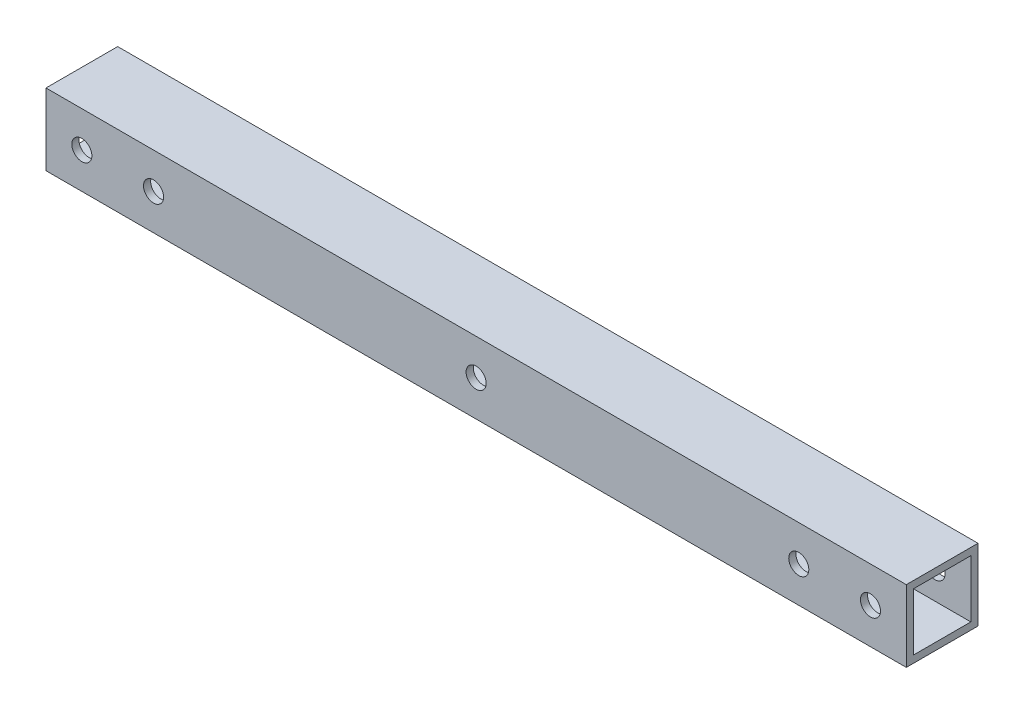
ISO-10303-21;
HEADER;
FILE_DESCRIPTION(('STEP AP214'),'2;1');
FILE_NAME('part.step','',(''),(''),'','','');
FILE_SCHEMA(('AUTOMOTIVE_DESIGN { 1 0 10303 214 1 1 1 1 }'));
ENDSEC;
DATA;
#1=APPLICATION_CONTEXT('core data for automotive mechanical design processes');
#2=APPLICATION_PROTOCOL_DEFINITION('international standard','automotive_design',2000,#1);
#3=PRODUCT_CONTEXT('',#1,'mechanical');
#4=PRODUCT('Part','Part','',(#3));
#5=PRODUCT_RELATED_PRODUCT_CATEGORY('part','',(#4));
#6=PRODUCT_DEFINITION_FORMATION('','',#4);
#7=PRODUCT_DEFINITION_CONTEXT('part definition',#1,'design');
#8=PRODUCT_DEFINITION('design','',#6,#7);
#9=PRODUCT_DEFINITION_SHAPE('','',#8);
#10=(LENGTH_UNIT() NAMED_UNIT(*) SI_UNIT(.MILLI.,.METRE.));
#11=(NAMED_UNIT(*) PLANE_ANGLE_UNIT() SI_UNIT($,.RADIAN.));
#12=(NAMED_UNIT(*) SI_UNIT($,.STERADIAN.) SOLID_ANGLE_UNIT());
#13=UNCERTAINTY_MEASURE_WITH_UNIT(LENGTH_MEASURE(1.E-05),#10,'distance_accuracy_value','');
#14=(GEOMETRIC_REPRESENTATION_CONTEXT(3) GLOBAL_UNCERTAINTY_ASSIGNED_CONTEXT((#13)) GLOBAL_UNIT_ASSIGNED_CONTEXT((#10,
#11,#12)) REPRESENTATION_CONTEXT('',''));
#15=CARTESIAN_POINT('',(0.,0.,0.));
#16=DIRECTION('',(0.,0.,1.));
#17=DIRECTION('',(1.,0.,0.));
#18=AXIS2_PLACEMENT_3D('',#15,#16,#17);
#19=CARTESIAN_POINT('',(180.,0.,0.));
#20=DIRECTION('',(1.,0.,0.));
#21=DIRECTION('',(0.,0.,-1.));
#22=AXIS2_PLACEMENT_3D('',#19,#20,#21);
#23=PLANE('',#22);
#24=DIRECTION('',(0.,1.,0.));
#25=VECTOR('',#24,1.);
#26=CARTESIAN_POINT('',(180.,7.5,-7.5));
#27=LINE('',#26,#25);
#28=CARTESIAN_POINT('',(180.,-7.5,-7.5));
#29=VERTEX_POINT('',#28);
#30=CARTESIAN_POINT('',(180.,7.5,-7.5));
#31=VERTEX_POINT('',#30);
#32=EDGE_CURVE('E164',#29,#31,#27,.T.);
#33=ORIENTED_EDGE('',*,*,#32,.T.);
#34=DIRECTION('',(0.,0.,1.));
#35=VECTOR('',#34,1.);
#36=CARTESIAN_POINT('',(180.,7.5,7.5));
#37=LINE('',#36,#35);
#38=CARTESIAN_POINT('',(180.,7.5,7.5));
#39=VERTEX_POINT('',#38);
#40=EDGE_CURVE('E167',#31,#39,#37,.T.);
#41=ORIENTED_EDGE('',*,*,#40,.T.);
#42=DIRECTION('',(0.,-1.,0.));
#43=VECTOR('',#42,1.);
#44=CARTESIAN_POINT('',(180.,7.5,7.5));
#45=LINE('',#44,#43);
#46=CARTESIAN_POINT('',(180.,-7.5,7.5));
#47=VERTEX_POINT('',#46);
#48=EDGE_CURVE('E170',#39,#47,#45,.T.);
#49=ORIENTED_EDGE('',*,*,#48,.T.);
#50=DIRECTION('',(0.,0.,-1.));
#51=VECTOR('',#50,1.);
#52=CARTESIAN_POINT('',(180.,-7.5,7.5));
#53=LINE('',#52,#51);
#54=EDGE_CURVE('E172',#47,#29,#53,.T.);
#55=ORIENTED_EDGE('',*,*,#54,.T.);
#56=EDGE_LOOP('',(#33,#41,#49,#55));
#57=FACE_BOUND('',#56,.T.);
#58=DIRECTION('',(0.,0.,1.));
#59=VECTOR('',#58,1.);
#60=CARTESIAN_POINT('',(180.,6.,7.5));
#61=LINE('',#60,#59);
#62=CARTESIAN_POINT('',(180.,6.,-6.));
#63=VERTEX_POINT('',#62);
#64=CARTESIAN_POINT('',(180.,6.,6.));
#65=VERTEX_POINT('',#64);
#66=EDGE_CURVE('E134',#63,#65,#61,.T.);
#67=ORIENTED_EDGE('',*,*,#66,.F.);
#68=DIRECTION('',(0.,1.,0.));
#69=VECTOR('',#68,1.);
#70=CARTESIAN_POINT('',(180.,7.5,-6.));
#71=LINE('',#70,#69);
#72=CARTESIAN_POINT('',(180.,-6.,-6.));
#73=VERTEX_POINT('',#72);
#74=EDGE_CURVE('E126',#73,#63,#71,.T.);
#75=ORIENTED_EDGE('',*,*,#74,.F.);
#76=DIRECTION('',(0.,0.,-1.));
#77=VECTOR('',#76,1.);
#78=CARTESIAN_POINT('',(180.,-6.,7.5));
#79=LINE('',#78,#77);
#80=CARTESIAN_POINT('',(180.,-6.,6.));
#81=VERTEX_POINT('',#80);
#82=EDGE_CURVE('E148',#81,#73,#79,.T.);
#83=ORIENTED_EDGE('',*,*,#82,.F.);
#84=DIRECTION('',(0.,-1.,0.));
#85=VECTOR('',#84,1.);
#86=CARTESIAN_POINT('',(180.,7.5,6.));
#87=LINE('',#86,#85);
#88=EDGE_CURVE('E146',#65,#81,#87,.T.);
#89=ORIENTED_EDGE('',*,*,#88,.F.);
#90=EDGE_LOOP('',(#67,#75,#83,#89));
#91=FACE_BOUND('',#90,.T.);
#92=ADVANCED_FACE('F59',(#57,#91),#23,.T.);
#93=CARTESIAN_POINT('',(0.,0.,0.));
#94=DIRECTION('',(1.,0.,0.));
#95=DIRECTION('',(0.,0.,-1.));
#96=AXIS2_PLACEMENT_3D('',#93,#94,#95);
#97=PLANE('',#96);
#98=DIRECTION('',(0.,1.,0.));
#99=VECTOR('',#98,1.);
#100=CARTESIAN_POINT('',(0.,7.5,-7.5));
#101=LINE('',#100,#99);
#102=CARTESIAN_POINT('',(0.,-7.5,-7.5));
#103=VERTEX_POINT('',#102);
#104=CARTESIAN_POINT('',(0.,7.5,-7.5));
#105=VERTEX_POINT('',#104);
#106=EDGE_CURVE('E142',#103,#105,#101,.T.);
#107=ORIENTED_EDGE('',*,*,#106,.F.);
#108=DIRECTION('',(0.,0.,-1.));
#109=VECTOR('',#108,1.);
#110=CARTESIAN_POINT('',(0.,-7.5,7.5));
#111=LINE('',#110,#109);
#112=CARTESIAN_POINT('',(0.,-7.5,7.5));
#113=VERTEX_POINT('',#112);
#114=EDGE_CURVE('E168',#113,#103,#111,.T.);
#115=ORIENTED_EDGE('',*,*,#114,.F.);
#116=DIRECTION('',(0.,-1.,0.));
#117=VECTOR('',#116,1.);
#118=CARTESIAN_POINT('',(0.,7.5,7.5));
#119=LINE('',#118,#117);
#120=CARTESIAN_POINT('',(0.,7.5,7.5));
#121=VERTEX_POINT('',#120);
#122=EDGE_CURVE('E179',#121,#113,#119,.T.);
#123=ORIENTED_EDGE('',*,*,#122,.F.);
#124=DIRECTION('',(0.,0.,1.));
#125=VECTOR('',#124,1.);
#126=CARTESIAN_POINT('',(0.,7.5,7.5));
#127=LINE('',#126,#125);
#128=EDGE_CURVE('E177',#105,#121,#127,.T.);
#129=ORIENTED_EDGE('',*,*,#128,.F.);
#130=EDGE_LOOP('',(#107,#115,#123,#129));
#131=FACE_BOUND('',#130,.T.);
#132=DIRECTION('',(0.,1.,0.));
#133=VECTOR('',#132,1.);
#134=CARTESIAN_POINT('',(0.,7.5,-6.));
#135=LINE('',#134,#133);
#136=CARTESIAN_POINT('',(0.,-6.,-6.));
#137=VERTEX_POINT('',#136);
#138=CARTESIAN_POINT('',(0.,6.,-6.));
#139=VERTEX_POINT('',#138);
#140=EDGE_CURVE('E84',#137,#139,#135,.T.);
#141=ORIENTED_EDGE('',*,*,#140,.T.);
#142=DIRECTION('',(0.,0.,1.));
#143=VECTOR('',#142,1.);
#144=CARTESIAN_POINT('',(0.,6.,7.5));
#145=LINE('',#144,#143);
#146=CARTESIAN_POINT('',(0.,6.,6.));
#147=VERTEX_POINT('',#146);
#148=EDGE_CURVE('E141',#139,#147,#145,.T.);
#149=ORIENTED_EDGE('',*,*,#148,.T.);
#150=DIRECTION('',(0.,-1.,0.));
#151=VECTOR('',#150,1.);
#152=CARTESIAN_POINT('',(0.,7.5,6.));
#153=LINE('',#152,#151);
#154=CARTESIAN_POINT('',(0.,-6.,6.));
#155=VERTEX_POINT('',#154);
#156=EDGE_CURVE('E156',#147,#155,#153,.T.);
#157=ORIENTED_EDGE('',*,*,#156,.T.);
#158=DIRECTION('',(0.,0.,-1.));
#159=VECTOR('',#158,1.);
#160=CARTESIAN_POINT('',(0.,-6.,7.5));
#161=LINE('',#160,#159);
#162=EDGE_CURVE('E135',#155,#137,#161,.T.);
#163=ORIENTED_EDGE('',*,*,#162,.T.);
#164=EDGE_LOOP('',(#141,#149,#157,#163));
#165=FACE_BOUND('',#164,.T.);
#166=ADVANCED_FACE('F237',(#131,#165),#97,.F.);
#167=CARTESIAN_POINT('',(180.,7.5,-7.5));
#168=DIRECTION('',(0.,0.,1.));
#169=DIRECTION('',(0.,-1.,0.));
#170=AXIS2_PLACEMENT_3D('',#167,#168,#169);
#171=PLANE('',#170);
#172=CARTESIAN_POINT('',(7.5,0.,-7.5));
#173=DIRECTION('',(0.,0.,1.));
#174=DIRECTION('',(1.,0.,0.));
#175=AXIS2_PLACEMENT_3D('',#172,#173,#174);
#176=CIRCLE('',#175,2.1);
#177=CARTESIAN_POINT('',(9.6,0.,-7.5));
#178=VERTEX_POINT('',#177);
#179=EDGE_CURVE('E290',#178,#178,#176,.T.);
#180=ORIENTED_EDGE('',*,*,#179,.T.);
#181=EDGE_LOOP('',(#180));
#182=FACE_BOUND('',#181,.T.);
#183=CARTESIAN_POINT('',(172.5,0.,-7.5));
#184=DIRECTION('',(0.,0.,1.));
#185=DIRECTION('',(-1.,0.,0.));
#186=AXIS2_PLACEMENT_3D('',#183,#184,#185);
#187=CIRCLE('',#186,2.09999999999999);
#188=CARTESIAN_POINT('',(170.4,0.,-7.5));
#189=VERTEX_POINT('',#188);
#190=EDGE_CURVE('E294',#189,#189,#187,.T.);
#191=ORIENTED_EDGE('',*,*,#190,.T.);
#192=EDGE_LOOP('',(#191));
#193=FACE_BOUND('',#192,.T.);
#194=CARTESIAN_POINT('',(157.5,0.,-7.5));
#195=DIRECTION('',(0.,0.,1.));
#196=DIRECTION('',(-1.,0.,0.));
#197=AXIS2_PLACEMENT_3D('',#194,#195,#196);
#198=CIRCLE('',#197,2.09999999999999);
#199=CARTESIAN_POINT('',(155.4,0.,-7.5));
#200=VERTEX_POINT('',#199);
#201=EDGE_CURVE('E298',#200,#200,#198,.T.);
#202=ORIENTED_EDGE('',*,*,#201,.T.);
#203=EDGE_LOOP('',(#202));
#204=FACE_BOUND('',#203,.T.);
#205=CARTESIAN_POINT('',(90.,0.,-7.5));
#206=DIRECTION('',(0.,0.,1.));
#207=DIRECTION('',(1.,0.,0.));
#208=AXIS2_PLACEMENT_3D('',#205,#206,#207);
#209=CIRCLE('',#208,2.1);
#210=CARTESIAN_POINT('',(92.1,0.,-7.5));
#211=VERTEX_POINT('',#210);
#212=EDGE_CURVE('E302',#211,#211,#209,.T.);
#213=ORIENTED_EDGE('',*,*,#212,.T.);
#214=EDGE_LOOP('',(#213));
#215=FACE_BOUND('',#214,.T.);
#216=CARTESIAN_POINT('',(22.5,0.,-7.5));
#217=DIRECTION('',(0.,0.,1.));
#218=DIRECTION('',(1.,0.,0.));
#219=AXIS2_PLACEMENT_3D('',#216,#217,#218);
#220=CIRCLE('',#219,2.1);
#221=CARTESIAN_POINT('',(24.6,0.,-7.5));
#222=VERTEX_POINT('',#221);
#223=EDGE_CURVE('E193',#222,#222,#220,.T.);
#224=ORIENTED_EDGE('',*,*,#223,.T.);
#225=EDGE_LOOP('',(#224));
#226=FACE_BOUND('',#225,.T.);
#227=ORIENTED_EDGE('',*,*,#106,.T.);
#228=DIRECTION('',(-1.,0.,0.));
#229=VECTOR('',#228,1.);
#230=CARTESIAN_POINT('',(180.,7.5,-7.5));
#231=LINE('',#230,#229);
#232=EDGE_CURVE('E12',#31,#105,#231,.T.);
#233=ORIENTED_EDGE('',*,*,#232,.F.);
#234=ORIENTED_EDGE('',*,*,#32,.F.);
#235=DIRECTION('',(-1.,0.,0.));
#236=VECTOR('',#235,1.);
#237=CARTESIAN_POINT('',(180.,-7.5,-7.5));
#238=LINE('',#237,#236);
#239=EDGE_CURVE('E174',#29,#103,#238,.T.);
#240=ORIENTED_EDGE('',*,*,#239,.T.);
#241=EDGE_LOOP('',(#227,#233,#234,#240));
#242=FACE_BOUND('',#241,.T.);
#243=ADVANCED_FACE('F61',(#182,#193,#204,#215,#226,#242),#171,.F.);
#244=CARTESIAN_POINT('',(180.,7.5,7.5));
#245=DIRECTION('',(0.,-1.,0.));
#246=DIRECTION('',(0.,0.,-1.));
#247=AXIS2_PLACEMENT_3D('',#244,#245,#246);
#248=PLANE('',#247);
#249=ORIENTED_EDGE('',*,*,#128,.T.);
#250=DIRECTION('',(-1.,0.,0.));
#251=VECTOR('',#250,1.);
#252=CARTESIAN_POINT('',(180.,7.5,7.5));
#253=LINE('',#252,#251);
#254=EDGE_CURVE('E68',#39,#121,#253,.T.);
#255=ORIENTED_EDGE('',*,*,#254,.F.);
#256=ORIENTED_EDGE('',*,*,#40,.F.);
#257=ORIENTED_EDGE('',*,*,#232,.T.);
#258=EDGE_LOOP('',(#249,#255,#256,#257));
#259=FACE_BOUND('',#258,.T.);
#260=ADVANCED_FACE('F265',(#259),#248,.F.);
#261=CARTESIAN_POINT('',(180.,7.5,7.5));
#262=DIRECTION('',(0.,0.,-1.));
#263=DIRECTION('',(0.,1.,0.));
#264=AXIS2_PLACEMENT_3D('',#261,#262,#263);
#265=PLANE('',#264);
#266=CARTESIAN_POINT('',(7.5,0.,7.5));
#267=DIRECTION('',(0.,0.,1.));
#268=DIRECTION('',(1.,0.,0.));
#269=AXIS2_PLACEMENT_3D('',#266,#267,#268);
#270=CIRCLE('',#269,2.1);
#271=CARTESIAN_POINT('',(9.6,0.,7.5));
#272=VERTEX_POINT('',#271);
#273=EDGE_CURVE('E344',#272,#272,#270,.T.);
#274=ORIENTED_EDGE('',*,*,#273,.F.);
#275=EDGE_LOOP('',(#274));
#276=FACE_BOUND('',#275,.T.);
#277=CARTESIAN_POINT('',(172.5,0.,7.5));
#278=DIRECTION('',(0.,0.,1.));
#279=DIRECTION('',(-1.,0.,0.));
#280=AXIS2_PLACEMENT_3D('',#277,#278,#279);
#281=CIRCLE('',#280,2.09999999999999);
#282=CARTESIAN_POINT('',(170.4,0.,7.5));
#283=VERTEX_POINT('',#282);
#284=EDGE_CURVE('E311',#283,#283,#281,.T.);
#285=ORIENTED_EDGE('',*,*,#284,.F.);
#286=EDGE_LOOP('',(#285));
#287=FACE_BOUND('',#286,.T.);
#288=CARTESIAN_POINT('',(157.5,0.,7.5));
#289=DIRECTION('',(0.,0.,1.));
#290=DIRECTION('',(-1.,0.,0.));
#291=AXIS2_PLACEMENT_3D('',#288,#289,#290);
#292=CIRCLE('',#291,2.09999999999999);
#293=CARTESIAN_POINT('',(155.4,0.,7.5));
#294=VERTEX_POINT('',#293);
#295=EDGE_CURVE('E334',#294,#294,#292,.T.);
#296=ORIENTED_EDGE('',*,*,#295,.F.);
#297=EDGE_LOOP('',(#296));
#298=FACE_BOUND('',#297,.T.);
#299=CARTESIAN_POINT('',(90.,0.,7.5));
#300=DIRECTION('',(0.,0.,1.));
#301=DIRECTION('',(1.,0.,0.));
#302=AXIS2_PLACEMENT_3D('',#299,#300,#301);
#303=CIRCLE('',#302,2.1);
#304=CARTESIAN_POINT('',(92.1,0.,7.5));
#305=VERTEX_POINT('',#304);
#306=EDGE_CURVE('E335',#305,#305,#303,.T.);
#307=ORIENTED_EDGE('',*,*,#306,.F.);
#308=EDGE_LOOP('',(#307));
#309=FACE_BOUND('',#308,.T.);
#310=CARTESIAN_POINT('',(22.5,0.,7.5));
#311=DIRECTION('',(0.,0.,1.));
#312=DIRECTION('',(1.,0.,0.));
#313=AXIS2_PLACEMENT_3D('',#310,#311,#312);
#314=CIRCLE('',#313,2.1);
#315=CARTESIAN_POINT('',(24.6,0.,7.5));
#316=VERTEX_POINT('',#315);
#317=EDGE_CURVE('E306',#316,#316,#314,.T.);
#318=ORIENTED_EDGE('',*,*,#317,.F.);
#319=EDGE_LOOP('',(#318));
#320=FACE_BOUND('',#319,.T.);
#321=ORIENTED_EDGE('',*,*,#122,.T.);
#322=DIRECTION('',(-1.,0.,0.));
#323=VECTOR('',#322,1.);
#324=CARTESIAN_POINT('',(180.,-7.5,7.5));
#325=LINE('',#324,#323);
#326=EDGE_CURVE('E184',#47,#113,#325,.T.);
#327=ORIENTED_EDGE('',*,*,#326,.F.);
#328=ORIENTED_EDGE('',*,*,#48,.F.);
#329=ORIENTED_EDGE('',*,*,#254,.T.);
#330=EDGE_LOOP('',(#321,#327,#328,#329));
#331=FACE_BOUND('',#330,.T.);
#332=ADVANCED_FACE('F262',(#276,#287,#298,#309,#320,#331),#265,.F.);
#333=CARTESIAN_POINT('',(180.,-7.5,7.5));
#334=DIRECTION('',(0.,1.,0.));
#335=DIRECTION('',(0.,0.,1.));
#336=AXIS2_PLACEMENT_3D('',#333,#334,#335);
#337=PLANE('',#336);
#338=ORIENTED_EDGE('',*,*,#114,.T.);
#339=ORIENTED_EDGE('',*,*,#239,.F.);
#340=ORIENTED_EDGE('',*,*,#54,.F.);
#341=ORIENTED_EDGE('',*,*,#326,.T.);
#342=EDGE_LOOP('',(#338,#339,#340,#341));
#343=FACE_BOUND('',#342,.T.);
#344=ADVANCED_FACE('F259',(#343),#337,.F.);
#345=CARTESIAN_POINT('',(180.,7.5,-6.));
#346=DIRECTION('',(0.,0.,1.));
#347=DIRECTION('',(0.,-1.,0.));
#348=AXIS2_PLACEMENT_3D('',#345,#346,#347);
#349=PLANE('',#348);
#350=CARTESIAN_POINT('',(7.5,0.,-6.));
#351=DIRECTION('',(0.,0.,1.));
#352=DIRECTION('',(0.,-1.,0.));
#353=AXIS2_PLACEMENT_3D('',#350,#351,#352);
#354=CIRCLE('',#353,2.1);
#355=CARTESIAN_POINT('',(7.5,-2.1,-6.));
#356=VERTEX_POINT('',#355);
#357=EDGE_CURVE('E154',#356,#356,#354,.T.);
#358=ORIENTED_EDGE('',*,*,#357,.F.);
#359=EDGE_LOOP('',(#358));
#360=FACE_BOUND('',#359,.T.);
#361=CARTESIAN_POINT('',(172.5,0.,-6.));
#362=DIRECTION('',(0.,0.,1.));
#363=DIRECTION('',(0.,-1.,0.));
#364=AXIS2_PLACEMENT_3D('',#361,#362,#363);
#365=CIRCLE('',#364,2.09999999999999);
#366=CARTESIAN_POINT('',(172.5,-2.09999999999997,-6.));
#367=VERTEX_POINT('',#366);
#368=EDGE_CURVE('E203',#367,#367,#365,.T.);
#369=ORIENTED_EDGE('',*,*,#368,.F.);
#370=EDGE_LOOP('',(#369));
#371=FACE_BOUND('',#370,.T.);
#372=CARTESIAN_POINT('',(157.5,0.,-6.));
#373=DIRECTION('',(0.,0.,1.));
#374=DIRECTION('',(0.,-1.,0.));
#375=AXIS2_PLACEMENT_3D('',#372,#373,#374);
#376=CIRCLE('',#375,2.09999999999999);
#377=CARTESIAN_POINT('',(157.5,-2.09999999999997,-6.));
#378=VERTEX_POINT('',#377);
#379=EDGE_CURVE('E200',#378,#378,#376,.T.);
#380=ORIENTED_EDGE('',*,*,#379,.F.);
#381=EDGE_LOOP('',(#380));
#382=FACE_BOUND('',#381,.T.);
#383=CARTESIAN_POINT('',(90.,0.,-6.));
#384=DIRECTION('',(0.,0.,1.));
#385=DIRECTION('',(0.,-1.,0.));
#386=AXIS2_PLACEMENT_3D('',#383,#384,#385);
#387=CIRCLE('',#386,2.1);
#388=CARTESIAN_POINT('',(90.,-2.10000000000001,-6.));
#389=VERTEX_POINT('',#388);
#390=EDGE_CURVE('E197',#389,#389,#387,.T.);
#391=ORIENTED_EDGE('',*,*,#390,.F.);
#392=EDGE_LOOP('',(#391));
#393=FACE_BOUND('',#392,.T.);
#394=CARTESIAN_POINT('',(22.5,0.,-6.));
#395=DIRECTION('',(0.,0.,1.));
#396=DIRECTION('',(0.,-1.,0.));
#397=AXIS2_PLACEMENT_3D('',#394,#395,#396);
#398=CIRCLE('',#397,2.1);
#399=CARTESIAN_POINT('',(22.5,-2.1,-6.));
#400=VERTEX_POINT('',#399);
#401=EDGE_CURVE('E192',#400,#400,#398,.T.);
#402=ORIENTED_EDGE('',*,*,#401,.F.);
#403=EDGE_LOOP('',(#402));
#404=FACE_BOUND('',#403,.T.);
#405=ORIENTED_EDGE('',*,*,#140,.F.);
#406=DIRECTION('',(-1.,0.,0.));
#407=VECTOR('',#406,1.);
#408=CARTESIAN_POINT('',(180.,-6.,-6.));
#409=LINE('',#408,#407);
#410=EDGE_CURVE('E130',#73,#137,#409,.T.);
#411=ORIENTED_EDGE('',*,*,#410,.F.);
#412=ORIENTED_EDGE('',*,*,#74,.T.);
#413=DIRECTION('',(-1.,0.,0.));
#414=VECTOR('',#413,1.);
#415=CARTESIAN_POINT('',(180.,6.,-6.));
#416=LINE('',#415,#414);
#417=EDGE_CURVE('E129',#63,#139,#416,.T.);
#418=ORIENTED_EDGE('',*,*,#417,.T.);
#419=EDGE_LOOP('',(#405,#411,#412,#418));
#420=FACE_BOUND('',#419,.T.);
#421=ADVANCED_FACE('F128',(#360,#371,#382,#393,#404,#420),#349,.T.);
#422=CARTESIAN_POINT('',(180.,6.,7.5));
#423=DIRECTION('',(0.,-1.,0.));
#424=DIRECTION('',(0.,0.,-1.));
#425=AXIS2_PLACEMENT_3D('',#422,#423,#424);
#426=PLANE('',#425);
#427=ORIENTED_EDGE('',*,*,#148,.F.);
#428=ORIENTED_EDGE('',*,*,#417,.F.);
#429=ORIENTED_EDGE('',*,*,#66,.T.);
#430=DIRECTION('',(-1.,0.,0.));
#431=VECTOR('',#430,1.);
#432=CARTESIAN_POINT('',(180.,6.,6.));
#433=LINE('',#432,#431);
#434=EDGE_CURVE('E143',#65,#147,#433,.T.);
#435=ORIENTED_EDGE('',*,*,#434,.T.);
#436=EDGE_LOOP('',(#427,#428,#429,#435));
#437=FACE_BOUND('',#436,.T.);
#438=ADVANCED_FACE('F138',(#437),#426,.T.);
#439=CARTESIAN_POINT('',(180.,7.5,6.));
#440=DIRECTION('',(0.,0.,-1.));
#441=DIRECTION('',(0.,1.,0.));
#442=AXIS2_PLACEMENT_3D('',#439,#440,#441);
#443=PLANE('',#442);
#444=CARTESIAN_POINT('',(7.5,0.,6.));
#445=DIRECTION('',(0.,0.,-1.));
#446=DIRECTION('',(0.,1.,0.));
#447=AXIS2_PLACEMENT_3D('',#444,#445,#446);
#448=CIRCLE('',#447,2.1);
#449=CARTESIAN_POINT('',(7.5,2.1,6.));
#450=VERTEX_POINT('',#449);
#451=EDGE_CURVE('E63',#450,#450,#448,.T.);
#452=ORIENTED_EDGE('',*,*,#451,.F.);
#453=EDGE_LOOP('',(#452));
#454=FACE_BOUND('',#453,.T.);
#455=CARTESIAN_POINT('',(172.5,0.,6.));
#456=DIRECTION('',(0.,0.,-1.));
#457=DIRECTION('',(0.,1.,0.));
#458=AXIS2_PLACEMENT_3D('',#455,#456,#457);
#459=CIRCLE('',#458,2.09999999999999);
#460=CARTESIAN_POINT('',(172.5,2.10000000000001,6.));
#461=VERTEX_POINT('',#460);
#462=EDGE_CURVE('E201',#461,#461,#459,.T.);
#463=ORIENTED_EDGE('',*,*,#462,.F.);
#464=EDGE_LOOP('',(#463));
#465=FACE_BOUND('',#464,.T.);
#466=CARTESIAN_POINT('',(157.5,0.,6.));
#467=DIRECTION('',(0.,0.,-1.));
#468=DIRECTION('',(0.,1.,0.));
#469=AXIS2_PLACEMENT_3D('',#466,#467,#468);
#470=CIRCLE('',#469,2.09999999999999);
#471=CARTESIAN_POINT('',(157.5,2.1,6.));
#472=VERTEX_POINT('',#471);
#473=EDGE_CURVE('E198',#472,#472,#470,.T.);
#474=ORIENTED_EDGE('',*,*,#473,.F.);
#475=EDGE_LOOP('',(#474));
#476=FACE_BOUND('',#475,.T.);
#477=CARTESIAN_POINT('',(90.,0.,6.));
#478=DIRECTION('',(0.,0.,-1.));
#479=DIRECTION('',(0.,1.,0.));
#480=AXIS2_PLACEMENT_3D('',#477,#478,#479);
#481=CIRCLE('',#480,2.1);
#482=CARTESIAN_POINT('',(90.,2.1,6.));
#483=VERTEX_POINT('',#482);
#484=EDGE_CURVE('E194',#483,#483,#481,.T.);
#485=ORIENTED_EDGE('',*,*,#484,.F.);
#486=EDGE_LOOP('',(#485));
#487=FACE_BOUND('',#486,.T.);
#488=CARTESIAN_POINT('',(22.5,0.,6.));
#489=DIRECTION('',(0.,0.,-1.));
#490=DIRECTION('',(0.,1.,0.));
#491=AXIS2_PLACEMENT_3D('',#488,#489,#490);
#492=CIRCLE('',#491,2.1);
#493=CARTESIAN_POINT('',(22.5,2.1,6.));
#494=VERTEX_POINT('',#493);
#495=EDGE_CURVE('E189',#494,#494,#492,.T.);
#496=ORIENTED_EDGE('',*,*,#495,.F.);
#497=EDGE_LOOP('',(#496));
#498=FACE_BOUND('',#497,.T.);
#499=ORIENTED_EDGE('',*,*,#156,.F.);
#500=ORIENTED_EDGE('',*,*,#434,.F.);
#501=ORIENTED_EDGE('',*,*,#88,.T.);
#502=DIRECTION('',(-1.,0.,0.));
#503=VECTOR('',#502,1.);
#504=CARTESIAN_POINT('',(180.,-6.,6.));
#505=LINE('',#504,#503);
#506=EDGE_CURVE('E76',#81,#155,#505,.T.);
#507=ORIENTED_EDGE('',*,*,#506,.T.);
#508=EDGE_LOOP('',(#499,#500,#501,#507));
#509=FACE_BOUND('',#508,.T.);
#510=ADVANCED_FACE('F223',(#454,#465,#476,#487,#498,#509),#443,.T.);
#511=CARTESIAN_POINT('',(180.,-6.,7.5));
#512=DIRECTION('',(0.,1.,0.));
#513=DIRECTION('',(0.,0.,1.));
#514=AXIS2_PLACEMENT_3D('',#511,#512,#513);
#515=PLANE('',#514);
#516=ORIENTED_EDGE('',*,*,#162,.F.);
#517=ORIENTED_EDGE('',*,*,#506,.F.);
#518=ORIENTED_EDGE('',*,*,#82,.T.);
#519=ORIENTED_EDGE('',*,*,#410,.T.);
#520=EDGE_LOOP('',(#516,#517,#518,#519));
#521=FACE_BOUND('',#520,.T.);
#522=ADVANCED_FACE('F226',(#521),#515,.T.);
#523=CARTESIAN_POINT('',(22.5,0.,-7.5));
#524=DIRECTION('',(0.,0.,1.));
#525=DIRECTION('',(1.,0.,0.));
#526=AXIS2_PLACEMENT_3D('',#523,#524,#525);
#527=CYLINDRICAL_SURFACE('',#526,2.1);
#528=ORIENTED_EDGE('',*,*,#495,.T.);
#529=EDGE_LOOP('',(#528));
#530=FACE_BOUND('',#529,.T.);
#531=ORIENTED_EDGE('',*,*,#317,.T.);
#532=EDGE_LOOP('',(#531));
#533=FACE_BOUND('',#532,.T.);
#534=ADVANCED_FACE('F239',(#530,#533),#527,.F.);
#535=CARTESIAN_POINT('',(90.,0.,-7.5));
#536=DIRECTION('',(0.,0.,1.));
#537=DIRECTION('',(1.,0.,0.));
#538=AXIS2_PLACEMENT_3D('',#535,#536,#537);
#539=CYLINDRICAL_SURFACE('',#538,2.1);
#540=ORIENTED_EDGE('',*,*,#484,.T.);
#541=EDGE_LOOP('',(#540));
#542=FACE_BOUND('',#541,.T.);
#543=ORIENTED_EDGE('',*,*,#306,.T.);
#544=EDGE_LOOP('',(#543));
#545=FACE_BOUND('',#544,.T.);
#546=ADVANCED_FACE('F244',(#542,#545),#539,.F.);
#547=CARTESIAN_POINT('',(157.5,0.,-7.5));
#548=DIRECTION('',(0.,0.,1.));
#549=DIRECTION('',(1.,0.,0.));
#550=AXIS2_PLACEMENT_3D('',#547,#548,#549);
#551=CYLINDRICAL_SURFACE('',#550,2.09999999999999);
#552=ORIENTED_EDGE('',*,*,#473,.T.);
#553=EDGE_LOOP('',(#552));
#554=FACE_BOUND('',#553,.T.);
#555=ORIENTED_EDGE('',*,*,#295,.T.);
#556=EDGE_LOOP('',(#555));
#557=FACE_BOUND('',#556,.T.);
#558=ADVANCED_FACE('F360',(#554,#557),#551,.F.);
#559=CARTESIAN_POINT('',(172.5,0.,-7.5));
#560=DIRECTION('',(0.,0.,1.));
#561=DIRECTION('',(1.,0.,0.));
#562=AXIS2_PLACEMENT_3D('',#559,#560,#561);
#563=CYLINDRICAL_SURFACE('',#562,2.09999999999999);
#564=ORIENTED_EDGE('',*,*,#462,.T.);
#565=EDGE_LOOP('',(#564));
#566=FACE_BOUND('',#565,.T.);
#567=ORIENTED_EDGE('',*,*,#284,.T.);
#568=EDGE_LOOP('',(#567));
#569=FACE_BOUND('',#568,.T.);
#570=ADVANCED_FACE('F349',(#566,#569),#563,.F.);
#571=CARTESIAN_POINT('',(7.5,0.,-7.5));
#572=DIRECTION('',(0.,0.,1.));
#573=DIRECTION('',(1.,0.,0.));
#574=AXIS2_PLACEMENT_3D('',#571,#572,#573);
#575=CYLINDRICAL_SURFACE('',#574,2.1);
#576=ORIENTED_EDGE('',*,*,#451,.T.);
#577=EDGE_LOOP('',(#576));
#578=FACE_BOUND('',#577,.T.);
#579=ORIENTED_EDGE('',*,*,#273,.T.);
#580=EDGE_LOOP('',(#579));
#581=FACE_BOUND('',#580,.T.);
#582=ADVANCED_FACE('F220',(#578,#581),#575,.F.);
#583=ORIENTED_EDGE('',*,*,#401,.T.);
#584=EDGE_LOOP('',(#583));
#585=FACE_BOUND('',#584,.T.);
#586=ORIENTED_EDGE('',*,*,#223,.F.);
#587=EDGE_LOOP('',(#586));
#588=FACE_BOUND('',#587,.T.);
#589=ADVANCED_FACE('F247',(#585,#588),#527,.F.);
#590=ORIENTED_EDGE('',*,*,#390,.T.);
#591=EDGE_LOOP('',(#590));
#592=FACE_BOUND('',#591,.T.);
#593=ORIENTED_EDGE('',*,*,#212,.F.);
#594=EDGE_LOOP('',(#593));
#595=FACE_BOUND('',#594,.T.);
#596=ADVANCED_FACE('F329',(#592,#595),#539,.F.);
#597=ORIENTED_EDGE('',*,*,#379,.T.);
#598=EDGE_LOOP('',(#597));
#599=FACE_BOUND('',#598,.T.);
#600=ORIENTED_EDGE('',*,*,#201,.F.);
#601=EDGE_LOOP('',(#600));
#602=FACE_BOUND('',#601,.T.);
#603=ADVANCED_FACE('F332',(#599,#602),#551,.F.);
#604=ORIENTED_EDGE('',*,*,#368,.T.);
#605=EDGE_LOOP('',(#604));
#606=FACE_BOUND('',#605,.T.);
#607=ORIENTED_EDGE('',*,*,#190,.F.);
#608=EDGE_LOOP('',(#607));
#609=FACE_BOUND('',#608,.T.);
#610=ADVANCED_FACE('F372',(#606,#609),#563,.F.);
#611=ORIENTED_EDGE('',*,*,#357,.T.);
#612=EDGE_LOOP('',(#611));
#613=FACE_BOUND('',#612,.T.);
#614=ORIENTED_EDGE('',*,*,#179,.F.);
#615=EDGE_LOOP('',(#614));
#616=FACE_BOUND('',#615,.T.);
#617=ADVANCED_FACE('F370',(#613,#616),#575,.F.);
#618=CLOSED_SHELL('',(#92,#166,#243,#260,#332,#344,#421,#438,#510,#522,#534,#546,#558,#570,#582,
#589,#596,#603,#610,#617));
#619=MANIFOLD_SOLID_BREP('B2',#618);
#620=ADVANCED_BREP_SHAPE_REPRESENTATION('',(#18,#619),#14);
#621=SHAPE_DEFINITION_REPRESENTATION(#9,#620);
ENDSEC;
END-ISO-10303-21;
